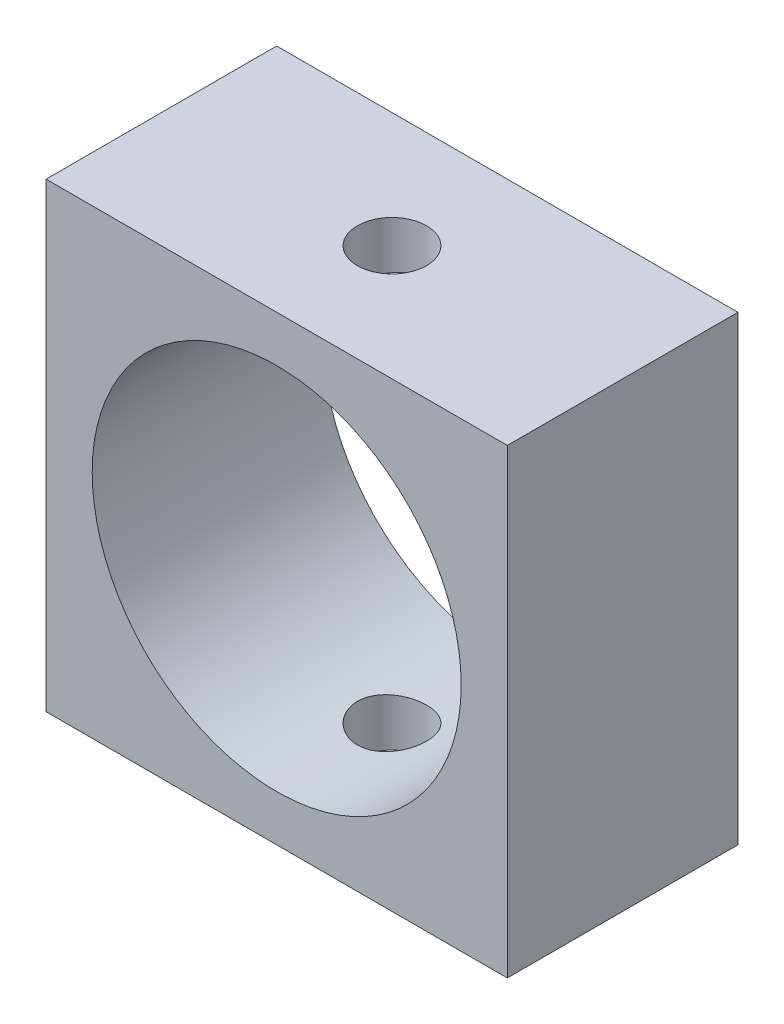
ISO-10303-21;
HEADER;
FILE_DESCRIPTION(('STEP AP214'),'2;1');
FILE_NAME('part.step','',(''),(''),'','','');
FILE_SCHEMA(('AUTOMOTIVE_DESIGN { 1 0 10303 214 1 1 1 1 }'));
ENDSEC;
DATA;
#1=APPLICATION_CONTEXT('core data for automotive mechanical design processes');
#2=APPLICATION_PROTOCOL_DEFINITION('international standard','automotive_design',2000,#1);
#3=PRODUCT_CONTEXT('',#1,'mechanical');
#4=PRODUCT('Part','Part','',(#3));
#5=PRODUCT_RELATED_PRODUCT_CATEGORY('part','',(#4));
#6=PRODUCT_DEFINITION_FORMATION('','',#4);
#7=PRODUCT_DEFINITION_CONTEXT('part definition',#1,'design');
#8=PRODUCT_DEFINITION('design','',#6,#7);
#9=PRODUCT_DEFINITION_SHAPE('','',#8);
#10=(LENGTH_UNIT() NAMED_UNIT(*) SI_UNIT(.MILLI.,.METRE.));
#11=(NAMED_UNIT(*) PLANE_ANGLE_UNIT() SI_UNIT($,.RADIAN.));
#12=(NAMED_UNIT(*) SI_UNIT($,.STERADIAN.) SOLID_ANGLE_UNIT());
#13=UNCERTAINTY_MEASURE_WITH_UNIT(LENGTH_MEASURE(1.E-05),#10,'distance_accuracy_value','');
#14=(GEOMETRIC_REPRESENTATION_CONTEXT(3) GLOBAL_UNCERTAINTY_ASSIGNED_CONTEXT((#13)) GLOBAL_UNIT_ASSIGNED_CONTEXT((#10,
#11,#12)) REPRESENTATION_CONTEXT('',''));
#15=CARTESIAN_POINT('',(0.,0.,0.));
#16=DIRECTION('',(0.,0.,1.));
#17=DIRECTION('',(1.,0.,0.));
#18=AXIS2_PLACEMENT_3D('',#15,#16,#17);
#19=CARTESIAN_POINT('',(0.,0.,10.));
#20=DIRECTION('',(0.,0.,-1.));
#21=DIRECTION('',(-1.,0.,0.));
#22=AXIS2_PLACEMENT_3D('',#19,#20,#21);
#23=PLANE('',#22);
#24=DIRECTION('',(0.,-1.,0.));
#25=VECTOR('',#24,1.);
#26=CARTESIAN_POINT('',(-10.,10.,10.));
#27=LINE('',#26,#25);
#28=CARTESIAN_POINT('',(-10.,10.,10.));
#29=VERTEX_POINT('',#28);
#30=CARTESIAN_POINT('',(-10.,-10.,10.));
#31=VERTEX_POINT('',#30);
#32=EDGE_CURVE('E106',#29,#31,#27,.T.);
#33=ORIENTED_EDGE('',*,*,#32,.T.);
#34=DIRECTION('',(1.,0.,0.));
#35=VECTOR('',#34,1.);
#36=CARTESIAN_POINT('',(10.,-10.,10.));
#37=LINE('',#36,#35);
#38=CARTESIAN_POINT('',(10.,-10.,10.));
#39=VERTEX_POINT('',#38);
#40=EDGE_CURVE('E101',#31,#39,#37,.T.);
#41=ORIENTED_EDGE('',*,*,#40,.T.);
#42=DIRECTION('',(0.,1.,0.));
#43=VECTOR('',#42,1.);
#44=CARTESIAN_POINT('',(10.,10.,10.));
#45=LINE('',#44,#43);
#46=CARTESIAN_POINT('',(10.,10.,10.));
#47=VERTEX_POINT('',#46);
#48=EDGE_CURVE('E104',#39,#47,#45,.T.);
#49=ORIENTED_EDGE('',*,*,#48,.T.);
#50=DIRECTION('',(-1.,0.,0.));
#51=VECTOR('',#50,1.);
#52=CARTESIAN_POINT('',(10.,10.,10.));
#53=LINE('',#52,#51);
#54=EDGE_CURVE('E71',#47,#29,#53,.T.);
#55=ORIENTED_EDGE('',*,*,#54,.T.);
#56=EDGE_LOOP('',(#33,#41,#49,#55));
#57=FACE_BOUND('',#56,.T.);
#58=CARTESIAN_POINT('',(0.,0.,10.));
#59=DIRECTION('',(0.,0.,1.));
#60=DIRECTION('',(1.,0.,0.));
#61=AXIS2_PLACEMENT_3D('',#58,#59,#60);
#62=CIRCLE('',#61,8.);
#63=CARTESIAN_POINT('',(8.,0.,10.));
#64=VERTEX_POINT('',#63);
#65=EDGE_CURVE('E122',#64,#64,#62,.T.);
#66=ORIENTED_EDGE('',*,*,#65,.F.);
#67=EDGE_LOOP('',(#66));
#68=FACE_BOUND('',#67,.T.);
#69=ADVANCED_FACE('F48',(#57,#68),#23,.F.);
#70=CARTESIAN_POINT('',(0.,0.,0.));
#71=DIRECTION('',(0.,0.,-1.));
#72=DIRECTION('',(-1.,0.,0.));
#73=AXIS2_PLACEMENT_3D('',#70,#71,#72);
#74=PLANE('',#73);
#75=DIRECTION('',(0.,-1.,0.));
#76=VECTOR('',#75,1.);
#77=CARTESIAN_POINT('',(-10.,10.,0.));
#78=LINE('',#77,#76);
#79=CARTESIAN_POINT('',(-10.,10.,0.));
#80=VERTEX_POINT('',#79);
#81=CARTESIAN_POINT('',(-10.,-10.,0.));
#82=VERTEX_POINT('',#81);
#83=EDGE_CURVE('E119',#80,#82,#78,.T.);
#84=ORIENTED_EDGE('',*,*,#83,.F.);
#85=DIRECTION('',(-1.,0.,0.));
#86=VECTOR('',#85,1.);
#87=CARTESIAN_POINT('',(10.,10.,0.));
#88=LINE('',#87,#86);
#89=CARTESIAN_POINT('',(10.,10.,0.));
#90=VERTEX_POINT('',#89);
#91=EDGE_CURVE('E94',#90,#80,#88,.T.);
#92=ORIENTED_EDGE('',*,*,#91,.F.);
#93=DIRECTION('',(0.,1.,0.));
#94=VECTOR('',#93,1.);
#95=CARTESIAN_POINT('',(10.,10.,0.));
#96=LINE('',#95,#94);
#97=CARTESIAN_POINT('',(10.,-10.,0.));
#98=VERTEX_POINT('',#97);
#99=EDGE_CURVE('E88',#98,#90,#96,.T.);
#100=ORIENTED_EDGE('',*,*,#99,.F.);
#101=DIRECTION('',(1.,0.,0.));
#102=VECTOR('',#101,1.);
#103=CARTESIAN_POINT('',(10.,-10.,0.));
#104=LINE('',#103,#102);
#105=EDGE_CURVE('E110',#82,#98,#104,.T.);
#106=ORIENTED_EDGE('',*,*,#105,.F.);
#107=EDGE_LOOP('',(#84,#92,#100,#106));
#108=FACE_BOUND('',#107,.T.);
#109=CARTESIAN_POINT('',(0.,0.,0.));
#110=DIRECTION('',(0.,0.,1.));
#111=DIRECTION('',(1.,0.,0.));
#112=AXIS2_PLACEMENT_3D('',#109,#110,#111);
#113=CIRCLE('',#112,8.);
#114=CARTESIAN_POINT('',(8.,0.,0.));
#115=VERTEX_POINT('',#114);
#116=EDGE_CURVE('E179',#115,#115,#113,.T.);
#117=ORIENTED_EDGE('',*,*,#116,.T.);
#118=EDGE_LOOP('',(#117));
#119=FACE_BOUND('',#118,.T.);
#120=ADVANCED_FACE('F151',(#108,#119),#74,.T.);
#121=CARTESIAN_POINT('',(-10.,10.,10.));
#122=DIRECTION('',(1.,0.,0.));
#123=DIRECTION('',(0.,0.,-1.));
#124=AXIS2_PLACEMENT_3D('',#121,#122,#123);
#125=PLANE('',#124);
#126=ORIENTED_EDGE('',*,*,#83,.T.);
#127=DIRECTION('',(0.,0.,-1.));
#128=VECTOR('',#127,1.);
#129=CARTESIAN_POINT('',(-10.,-10.,10.));
#130=LINE('',#129,#128);
#131=EDGE_CURVE('E13',#31,#82,#130,.T.);
#132=ORIENTED_EDGE('',*,*,#131,.F.);
#133=ORIENTED_EDGE('',*,*,#32,.F.);
#134=DIRECTION('',(0.,0.,-1.));
#135=VECTOR('',#134,1.);
#136=CARTESIAN_POINT('',(-10.,10.,10.));
#137=LINE('',#136,#135);
#138=EDGE_CURVE('E115',#29,#80,#137,.T.);
#139=ORIENTED_EDGE('',*,*,#138,.T.);
#140=EDGE_LOOP('',(#126,#132,#133,#139));
#141=FACE_BOUND('',#140,.T.);
#142=ADVANCED_FACE('F50',(#141),#125,.F.);
#143=CARTESIAN_POINT('',(10.,-10.,10.));
#144=DIRECTION('',(0.,1.,0.));
#145=DIRECTION('',(-1.,0.,0.));
#146=AXIS2_PLACEMENT_3D('',#143,#144,#145);
#147=PLANE('',#146);
#148=CARTESIAN_POINT('',(0.,-10.,5.));
#149=DIRECTION('',(0.,1.,0.));
#150=DIRECTION('',(0.,0.,1.));
#151=AXIS2_PLACEMENT_3D('',#148,#149,#150);
#152=CIRCLE('',#151,1.5);
#153=CARTESIAN_POINT('',(0.,-10.,6.5));
#154=VERTEX_POINT('',#153);
#155=EDGE_CURVE('E131',#154,#154,#152,.T.);
#156=ORIENTED_EDGE('',*,*,#155,.T.);
#157=EDGE_LOOP('',(#156));
#158=FACE_BOUND('',#157,.T.);
#159=ORIENTED_EDGE('',*,*,#105,.T.);
#160=DIRECTION('',(0.,0.,-1.));
#161=VECTOR('',#160,1.);
#162=CARTESIAN_POINT('',(10.,-10.,10.));
#163=LINE('',#162,#161);
#164=EDGE_CURVE('E62',#39,#98,#163,.T.);
#165=ORIENTED_EDGE('',*,*,#164,.F.);
#166=ORIENTED_EDGE('',*,*,#40,.F.);
#167=ORIENTED_EDGE('',*,*,#131,.T.);
#168=EDGE_LOOP('',(#159,#165,#166,#167));
#169=FACE_BOUND('',#168,.T.);
#170=ADVANCED_FACE('F109',(#158,#169),#147,.F.);
#171=CARTESIAN_POINT('',(10.,10.,10.));
#172=DIRECTION('',(-1.,0.,0.));
#173=DIRECTION('',(0.,-1.,0.));
#174=AXIS2_PLACEMENT_3D('',#171,#172,#173);
#175=PLANE('',#174);
#176=ORIENTED_EDGE('',*,*,#99,.T.);
#177=DIRECTION('',(0.,0.,-1.));
#178=VECTOR('',#177,1.);
#179=CARTESIAN_POINT('',(10.,10.,10.));
#180=LINE('',#179,#178);
#181=EDGE_CURVE('E111',#47,#90,#180,.T.);
#182=ORIENTED_EDGE('',*,*,#181,.F.);
#183=ORIENTED_EDGE('',*,*,#48,.F.);
#184=ORIENTED_EDGE('',*,*,#164,.T.);
#185=EDGE_LOOP('',(#176,#182,#183,#184));
#186=FACE_BOUND('',#185,.T.);
#187=ADVANCED_FACE('F113',(#186),#175,.F.);
#188=CARTESIAN_POINT('',(10.,10.,10.));
#189=DIRECTION('',(0.,-1.,0.));
#190=DIRECTION('',(1.,0.,0.));
#191=AXIS2_PLACEMENT_3D('',#188,#189,#190);
#192=PLANE('',#191);
#193=CARTESIAN_POINT('',(0.,10.,5.));
#194=DIRECTION('',(0.,1.,0.));
#195=DIRECTION('',(0.,0.,1.));
#196=AXIS2_PLACEMENT_3D('',#193,#194,#195);
#197=CIRCLE('',#196,1.5);
#198=CARTESIAN_POINT('',(0.,10.,6.5));
#199=VERTEX_POINT('',#198);
#200=EDGE_CURVE('E172',#199,#199,#197,.T.);
#201=ORIENTED_EDGE('',*,*,#200,.F.);
#202=EDGE_LOOP('',(#201));
#203=FACE_BOUND('',#202,.T.);
#204=ORIENTED_EDGE('',*,*,#91,.T.);
#205=ORIENTED_EDGE('',*,*,#138,.F.);
#206=ORIENTED_EDGE('',*,*,#54,.F.);
#207=ORIENTED_EDGE('',*,*,#181,.T.);
#208=EDGE_LOOP('',(#204,#205,#206,#207));
#209=FACE_BOUND('',#208,.T.);
#210=ADVANCED_FACE('F147',(#203,#209),#192,.F.);
#211=CARTESIAN_POINT('',(0.,0.,10.));
#212=DIRECTION('',(0.,0.,-1.));
#213=DIRECTION('',(-1.,0.,0.));
#214=AXIS2_PLACEMENT_3D('',#211,#212,#213);
#215=CYLINDRICAL_SURFACE('',#214,8.);
#216=CARTESIAN_POINT('',(0.,-8.,6.5));
#217=CARTESIAN_POINT('',(0.0834717464654725,-7.99999848833852,6.49999681041172));
#218=CARTESIAN_POINT('',(0.1669849927301,-7.99868009921714,6.49300892338062));
#219=CARTESIAN_POINT('',(0.331658129841799,-7.9935478589052,6.46526000488165));
#220=CARTESIAN_POINT('',(0.412815974152227,-7.98973190166897,6.44448734936027));
#221=CARTESIAN_POINT('',(0.570372961851803,-7.98003138765458,6.38982729874066));
#222=CARTESIAN_POINT('',(0.646776330685345,-7.97414869946483,6.35595174754746));
#223=CARTESIAN_POINT('',(0.792807973094008,-7.96095710599783,6.27608112307718));
#224=CARTESIAN_POINT('',(0.862436794477324,-7.9536483161829,6.23008703085518));
#225=CARTESIAN_POINT('',(0.993783715930504,-7.93831336430504,6.12670023199633));
#226=CARTESIAN_POINT('',(1.05540895503183,-7.93028034856351,6.06919055532986));
#227=CARTESIAN_POINT('',(1.16819606135369,-7.9144531845865,5.94465669091244));
#228=CARTESIAN_POINT('',(1.21935717689242,-7.90665905354527,5.87763182023072));
#229=CARTESIAN_POINT('',(1.31014998665793,-7.89212551245005,5.73531391163603));
#230=CARTESIAN_POINT('',(1.34968721969605,-7.88539493886182,5.65995962968276));
#231=CARTESIAN_POINT('',(1.41550524332283,-7.87384713211987,5.50353108482321));
#232=CARTESIAN_POINT('',(1.44178717713098,-7.86902973396962,5.42245731588878));
#233=CARTESIAN_POINT('',(1.480050535035,-7.8619226957455,5.25788476908559));
#234=CARTESIAN_POINT('',(1.49219390192039,-7.85960445366405,5.17442490279654));
#235=CARTESIAN_POINT('',(1.50233808095347,-7.85767197152761,5.00662261519175));
#236=CARTESIAN_POINT('',(1.50034016135374,-7.8580574889876,4.9222802736977));
#237=CARTESIAN_POINT('',(1.48238979602363,-7.86146292701753,4.75628047473395));
#238=CARTESIAN_POINT('',(1.46662149996045,-7.86444808147334,4.67460228569985));
#239=CARTESIAN_POINT('',(1.42186799396207,-7.87266183284666,4.51507158021739));
#240=CARTESIAN_POINT('',(1.392882222395,-7.87789052509516,4.4372192264907));
#241=CARTESIAN_POINT('',(1.322336471793,-7.89003855292588,4.28701132099974));
#242=CARTESIAN_POINT('',(1.28070213532456,-7.89696783823366,4.21469152941919));
#243=CARTESIAN_POINT('',(1.18609368930416,-7.91172971602918,4.07799527145977));
#244=CARTESIAN_POINT('',(1.13311842889266,-7.91956240015522,4.0136196122852));
#245=CARTESIAN_POINT('',(1.01633905685298,-7.93540001272164,3.89357504432754));
#246=CARTESIAN_POINT('',(0.952377436860684,-7.94340571024031,3.83805934754826));
#247=CARTESIAN_POINT('',(0.815968037098828,-7.95857386108318,3.7385227593246));
#248=CARTESIAN_POINT('',(0.743520172255771,-7.96573630595245,3.69450198312958));
#249=CARTESIAN_POINT('',(0.59203498887467,-7.97842539677509,3.61918224612998));
#250=CARTESIAN_POINT('',(0.512989564446495,-7.98394999136289,3.5878992208821));
#251=CARTESIAN_POINT('',(0.350639115398698,-7.99272505402719,3.53909790690784));
#252=CARTESIAN_POINT('',(0.267334544277789,-7.99597576367994,3.52157815595464));
#253=CARTESIAN_POINT('',(0.100148652903387,-7.99980360641981,3.50101396898173));
#254=CARTESIAN_POINT('',(0.0162940126341372,-8.00041950912279,3.49775960847027));
#255=CARTESIAN_POINT('',(-0.150761248092182,-7.99901543598228,3.50525547954765));
#256=CARTESIAN_POINT('',(-0.233961900480383,-7.99699558964431,3.51600502306526));
#257=CARTESIAN_POINT('',(-0.396681573218215,-7.99057111500406,3.55102903518337));
#258=CARTESIAN_POINT('',(-0.476224261046061,-7.98618522374031,3.57519728253781));
#259=CARTESIAN_POINT('',(-0.630128631824631,-7.97551842212498,3.63625770677879));
#260=CARTESIAN_POINT('',(-0.704489962595101,-7.96923738311334,3.67315074756579));
#261=CARTESIAN_POINT('',(-0.846816671513212,-7.95538030357666,3.75907812815951));
#262=CARTESIAN_POINT('',(-0.914703277015119,-7.94779086174563,3.80824073853684));
#263=CARTESIAN_POINT('',(-1.04133832326454,-7.93219343489712,3.91713813736236));
#264=CARTESIAN_POINT('',(-1.10008590976086,-7.92418541084687,3.97687391300133));
#265=CARTESIAN_POINT('',(-1.20757295872048,-7.9085247569745,4.10617231891143));
#266=CARTESIAN_POINT('',(-1.25616916218576,-7.90087825860257,4.17585490812539));
#267=CARTESIAN_POINT('',(-1.34096675057787,-7.88692985578532,4.32251762452375));
#268=CARTESIAN_POINT('',(-1.37716859613924,-7.8806279013735,4.39949748037047));
#269=CARTESIAN_POINT('',(-1.43594673512823,-7.87013024209574,4.55820586724254));
#270=CARTESIAN_POINT('',(-1.45858868794786,-7.86592440436878,4.63990937955933));
#271=CARTESIAN_POINT('',(-1.48980679326235,-7.86007203802415,4.8060472225214));
#272=CARTESIAN_POINT('',(-1.49838453270708,-7.8584252206579,4.8904812439704));
#273=CARTESIAN_POINT('',(-1.50117762148355,-7.85789199803857,5.05824833144151));
#274=CARTESIAN_POINT('',(-1.49561895003499,-7.85896215974293,5.14157758095699));
#275=CARTESIAN_POINT('',(-1.47079175378803,-7.86364600659998,5.30609142204529));
#276=CARTESIAN_POINT('',(-1.45152331089332,-7.86725967655747,5.38727602642744));
#277=CARTESIAN_POINT('',(-1.39991887583263,-7.8766050802318,5.54507448479548));
#278=CARTESIAN_POINT('',(-1.36760735397252,-7.88233284594965,5.62169659134577));
#279=CARTESIAN_POINT('',(-1.29085868912204,-7.8952638755184,5.76846825424084));
#280=CARTESIAN_POINT('',(-1.24642068948186,-7.90246724360119,5.83861735284478));
#281=CARTESIAN_POINT('',(-1.14589487339535,-7.91767266107745,5.97158368004229));
#282=CARTESIAN_POINT('',(-1.08964259864303,-7.92568505353043,6.0342754125671));
#283=CARTESIAN_POINT('',(-0.967427926742289,-7.94152833918735,6.14940516246452));
#284=CARTESIAN_POINT('',(-0.901463301891614,-7.94935919027328,6.20184082098014));
#285=CARTESIAN_POINT('',(-0.760984945071871,-7.96403975968049,6.29541095262706));
#286=CARTESIAN_POINT('',(-0.686399590640515,-7.97088000990561,6.33643942849064));
#287=CARTESIAN_POINT('',(-0.531290113653832,-7.98271619380687,6.40531763660513));
#288=CARTESIAN_POINT('',(-0.450771651705247,-7.98771385879037,6.43317974704691));
#289=CARTESIAN_POINT('',(-0.308347202825152,-7.99428290707632,6.46927731441868));
#290=CARTESIAN_POINT('',(-0.247273810251869,-7.99641470878206,6.4807786303128));
#291=CARTESIAN_POINT('',(-0.124141247115156,-7.9992737995401,6.49614106211645));
#292=CARTESIAN_POINT('',(-0.0620821016527076,-8.00000112429805,6.50000237225591));
#293=CARTESIAN_POINT('',(0.,-8.,6.5));
#294=B_SPLINE_CURVE_WITH_KNOTS('',3,(#216,#217,#218,#219,#220,#221,#222,#223,#224,#225,#226,
#227,#228,#229,#230,#231,#232,#233,#234,#235,#236,#237,#238,#239,#240,#241,#242,#243,#244,#245,
#246,#247,#248,#249,#250,#251,#252,#253,#254,#255,#256,#257,#258,#259,#260,#261,#262,#263,#264,
#265,#266,#267,#268,#269,#270,#271,#272,#273,#274,#275,#276,#277,#278,#279,#280,#281,#282,#283,
#284,#285,#286,#287,#288,#289,#290,#291,#292,#293),.UNSPECIFIED.,.T.,.F.,(4,2,2,2,2,2,2,2,2,2,2,
2,2,2,2,2,2,2,2,2,2,2,2,2,2,2,2,2,2,2,2,2,2,2,2,2,2,2,4),(0.,0.250188200964924,
0.500587642535452,0.750761271230907,1.00091465336891,1.2537511801363,1.50660586283617,
1.76146190504357,2.01629596311948,2.26818151445336,2.52004447587256,2.76859000612765,
3.01714609846786,3.26719262629531,3.51726454049859,3.77127768464077,4.02529337544948,
4.27962588321699,4.53393136673745,4.78448174076097,5.03501980464583,5.28360233907828,
5.53220175338032,5.78351778017708,6.03485728413098,6.28953436987299,6.54420198954945,
6.79762627818559,7.05102196946513,7.30039252231748,7.54976158541507,7.79866496207693,
8.04758592655423,8.3002336996638,8.55293951262255,8.80792048916314,9.06266126931173,
9.24874344524409,9.43482089039541),.UNSPECIFIED.);
#295=CARTESIAN_POINT('',(0.,-8.,6.5));
#296=VERTEX_POINT('',#295);
#297=EDGE_CURVE('E52',#296,#296,#294,.T.);
#298=ORIENTED_EDGE('',*,*,#297,.F.);
#299=EDGE_LOOP('',(#298));
#300=FACE_BOUND('',#299,.T.);
#301=CARTESIAN_POINT('',(0.,8.,6.5));
#302=CARTESIAN_POINT('',(-0.0834717464654692,7.99999848833852,6.49999681041172));
#303=CARTESIAN_POINT('',(-0.166984992730097,7.99868009921714,6.49300892338062));
#304=CARTESIAN_POINT('',(-0.331658129841796,7.9935478589052,6.46526000488165));
#305=CARTESIAN_POINT('',(-0.412815974152224,7.98973190166897,6.44448734936027));
#306=CARTESIAN_POINT('',(-0.5703729618518,7.98003138765458,6.38982729874066));
#307=CARTESIAN_POINT('',(-0.646776330685343,7.97414869946483,6.35595174754746));
#308=CARTESIAN_POINT('',(-0.792807973094005,7.96095710599783,6.27608112307718));
#309=CARTESIAN_POINT('',(-0.862436794477322,7.9536483161829,6.23008703085518));
#310=CARTESIAN_POINT('',(-0.993783715930501,7.93831336430504,6.12670023199632));
#311=CARTESIAN_POINT('',(-1.05540895503183,7.93028034856351,6.06919055532986));
#312=CARTESIAN_POINT('',(-1.16819606135369,7.9144531845865,5.94465669091244));
#313=CARTESIAN_POINT('',(-1.21935717689241,7.90665905354528,5.87763182023071));
#314=CARTESIAN_POINT('',(-1.31014998665793,7.89212551245006,5.73531391163603));
#315=CARTESIAN_POINT('',(-1.34968721969605,7.88539493886182,5.65995962968276));
#316=CARTESIAN_POINT('',(-1.41550524332283,7.87384713211987,5.50353108482321));
#317=CARTESIAN_POINT('',(-1.44178717713098,7.86902973396962,5.42245731588878));
#318=CARTESIAN_POINT('',(-1.480050535035,7.8619226957455,5.25788476908559));
#319=CARTESIAN_POINT('',(-1.49219390192039,7.85960445366405,5.17442490279653));
#320=CARTESIAN_POINT('',(-1.50233808095346,7.85767197152761,5.00662261519175));
#321=CARTESIAN_POINT('',(-1.50034016135374,7.8580574889876,4.9222802736977));
#322=CARTESIAN_POINT('',(-1.48238979602362,7.86146292701753,4.75628047473395));
#323=CARTESIAN_POINT('',(-1.46662149996045,7.86444808147334,4.67460228569985));
#324=CARTESIAN_POINT('',(-1.42186799396207,7.87266183284666,4.51507158021739));
#325=CARTESIAN_POINT('',(-1.39288222239499,7.87789052509516,4.4372192264907));
#326=CARTESIAN_POINT('',(-1.322336471793,7.89003855292589,4.28701132099974));
#327=CARTESIAN_POINT('',(-1.28070213532456,7.89696783823366,4.21469152941919));
#328=CARTESIAN_POINT('',(-1.18609368930416,7.91172971602918,4.07799527145977));
#329=CARTESIAN_POINT('',(-1.13311842889266,7.91956240015522,4.0136196122852));
#330=CARTESIAN_POINT('',(-1.01633905685297,7.93540001272164,3.89357504432754));
#331=CARTESIAN_POINT('',(-0.95237743686068,7.94340571024031,3.83805934754826));
#332=CARTESIAN_POINT('',(-0.815968037098824,7.95857386108318,3.73852275932459));
#333=CARTESIAN_POINT('',(-0.743520172255767,7.96573630595245,3.69450198312958));
#334=CARTESIAN_POINT('',(-0.592034988874666,7.97842539677509,3.61918224612998));
#335=CARTESIAN_POINT('',(-0.512989564446492,7.98394999136289,3.58789922088211));
#336=CARTESIAN_POINT('',(-0.350639115398695,7.99272505402719,3.53909790690784));
#337=CARTESIAN_POINT('',(-0.267334544277786,7.99597576367994,3.52157815595464));
#338=CARTESIAN_POINT('',(-0.100148652903384,7.99980360641981,3.50101396898173));
#339=CARTESIAN_POINT('',(-0.0162940126341337,8.00041950912279,3.49775960847027));
#340=CARTESIAN_POINT('',(0.150761248092186,7.99901543598228,3.50525547954765));
#341=CARTESIAN_POINT('',(0.233961900480387,7.99699558964431,3.51600502306526));
#342=CARTESIAN_POINT('',(0.396681573218219,7.99057111500406,3.55102903518337));
#343=CARTESIAN_POINT('',(0.476224261046065,7.98618522374031,3.57519728253781));
#344=CARTESIAN_POINT('',(0.630128631824635,7.97551842212498,3.63625770677879));
#345=CARTESIAN_POINT('',(0.704489962595105,7.96923738311334,3.67315074756579));
#346=CARTESIAN_POINT('',(0.846816671513216,7.95538030357666,3.75907812815951));
#347=CARTESIAN_POINT('',(0.914703277015123,7.94779086174563,3.80824073853684));
#348=CARTESIAN_POINT('',(1.04133832326455,7.93219343489711,3.91713813736236));
#349=CARTESIAN_POINT('',(1.10008590976087,7.92418541084687,3.97687391300133));
#350=CARTESIAN_POINT('',(1.20757295872048,7.9085247569745,4.10617231891143));
#351=CARTESIAN_POINT('',(1.25616916218577,7.90087825860257,4.17585490812539));
#352=CARTESIAN_POINT('',(1.34096675057787,7.88692985578532,4.32251762452375));
#353=CARTESIAN_POINT('',(1.37716859613924,7.8806279013735,4.39949748037047));
#354=CARTESIAN_POINT('',(1.43594673512823,7.87013024209574,4.55820586724254));
#355=CARTESIAN_POINT('',(1.45858868794786,7.86592440436878,4.63990937955933));
#356=CARTESIAN_POINT('',(1.48980679326236,7.86007203802415,4.8060472225214));
#357=CARTESIAN_POINT('',(1.49838453270708,7.8584252206579,4.8904812439704));
#358=CARTESIAN_POINT('',(1.50117762148355,7.85789199803857,5.05824833144151));
#359=CARTESIAN_POINT('',(1.49561895003499,7.85896215974293,5.141577580957));
#360=CARTESIAN_POINT('',(1.47079175378803,7.86364600659998,5.30609142204529));
#361=CARTESIAN_POINT('',(1.45152331089332,7.86725967655747,5.38727602642744));
#362=CARTESIAN_POINT('',(1.39991887583263,7.8766050802318,5.54507448479548));
#363=CARTESIAN_POINT('',(1.36760735397253,7.88233284594965,5.62169659134577));
#364=CARTESIAN_POINT('',(1.29085868912204,7.8952638755184,5.76846825424084));
#365=CARTESIAN_POINT('',(1.24642068948186,7.90246724360119,5.83861735284478));
#366=CARTESIAN_POINT('',(1.14589487339535,7.91767266107745,5.9715836800423));
#367=CARTESIAN_POINT('',(1.08964259864304,7.92568505353043,6.0342754125671));
#368=CARTESIAN_POINT('',(0.967427926742293,7.94152833918735,6.14940516246452));
#369=CARTESIAN_POINT('',(0.901463301891617,7.94935919027328,6.20184082098014));
#370=CARTESIAN_POINT('',(0.760984945071874,7.96403975968049,6.29541095262706));
#371=CARTESIAN_POINT('',(0.686399590640518,7.97088000990561,6.33643942849064));
#372=CARTESIAN_POINT('',(0.531290113653835,7.98271619380687,6.40531763660514));
#373=CARTESIAN_POINT('',(0.45077165170525,7.98771385879037,6.43317974704691));
#374=CARTESIAN_POINT('',(0.308347202825156,7.99428290707632,6.46927731441868));
#375=CARTESIAN_POINT('',(0.247273810251872,7.99641470878206,6.4807786303128));
#376=CARTESIAN_POINT('',(0.124141247115159,7.9992737995401,6.49614106211645));
#377=CARTESIAN_POINT('',(0.0620821016527111,8.00000112429805,6.50000237225591));
#378=CARTESIAN_POINT('',(0.,8.,6.5));
#379=B_SPLINE_CURVE_WITH_KNOTS('',3,(#301,#302,#303,#304,#305,#306,#307,#308,#309,#310,#311,
#312,#313,#314,#315,#316,#317,#318,#319,#320,#321,#322,#323,#324,#325,#326,#327,#328,#329,#330,
#331,#332,#333,#334,#335,#336,#337,#338,#339,#340,#341,#342,#343,#344,#345,#346,#347,#348,#349,
#350,#351,#352,#353,#354,#355,#356,#357,#358,#359,#360,#361,#362,#363,#364,#365,#366,#367,#368,
#369,#370,#371,#372,#373,#374,#375,#376,#377,#378),.UNSPECIFIED.,.T.,.F.,(4,2,2,2,2,2,2,2,2,2,2,
2,2,2,2,2,2,2,2,2,2,2,2,2,2,2,2,2,2,2,2,2,2,2,2,2,2,2,4),(0.,0.250188200964924,
0.500587642535452,0.750761271230908,1.00091465336891,1.25375118013631,1.50660586283617,
1.76146190504357,2.01629596311949,2.26818151445336,2.52004447587256,2.76859000612766,
3.01714609846787,3.26719262629531,3.5172645404986,3.77127768464077,4.02529337544948,
4.27962588321699,4.53393136673745,4.78448174076097,5.03501980464583,5.28360233907828,
5.53220175338032,5.78351778017708,6.03485728413098,6.28953436987299,6.54420198954945,
6.79762627818559,7.05102196946513,7.30039252231749,7.54976158541507,7.79866496207693,
8.04758592655423,8.3002336996638,8.55293951262255,8.80792048916315,9.06266126931173,
9.24874344524409,9.43482089039541),.UNSPECIFIED.);
#380=CARTESIAN_POINT('',(0.,8.,6.5));
#381=VERTEX_POINT('',#380);
#382=EDGE_CURVE('E127',#381,#381,#379,.T.);
#383=ORIENTED_EDGE('',*,*,#382,.F.);
#384=EDGE_LOOP('',(#383));
#385=FACE_BOUND('',#384,.T.);
#386=ORIENTED_EDGE('',*,*,#65,.T.);
#387=EDGE_LOOP('',(#386));
#388=FACE_BOUND('',#387,.T.);
#389=ORIENTED_EDGE('',*,*,#116,.F.);
#390=EDGE_LOOP('',(#389));
#391=FACE_BOUND('',#390,.T.);
#392=ADVANCED_FACE('F132',(#300,#385,#388,#391),#215,.F.);
#393=CARTESIAN_POINT('',(0.,-10.,5.));
#394=DIRECTION('',(0.,1.,0.));
#395=DIRECTION('',(0.,0.,1.));
#396=AXIS2_PLACEMENT_3D('',#393,#394,#395);
#397=CYLINDRICAL_SURFACE('',#396,1.5);
#398=ORIENTED_EDGE('',*,*,#382,.T.);
#399=EDGE_LOOP('',(#398));
#400=FACE_BOUND('',#399,.T.);
#401=ORIENTED_EDGE('',*,*,#200,.T.);
#402=EDGE_LOOP('',(#401));
#403=FACE_BOUND('',#402,.T.);
#404=ADVANCED_FACE('F135',(#400,#403),#397,.F.);
#405=ORIENTED_EDGE('',*,*,#297,.T.);
#406=EDGE_LOOP('',(#405));
#407=FACE_BOUND('',#406,.T.);
#408=ORIENTED_EDGE('',*,*,#155,.F.);
#409=EDGE_LOOP('',(#408));
#410=FACE_BOUND('',#409,.T.);
#411=ADVANCED_FACE('F138',(#407,#410),#397,.F.);
#412=CLOSED_SHELL('',(#69,#120,#142,#170,#187,#210,#392,#404,#411));
#413=MANIFOLD_SOLID_BREP('B2',#412);
#414=ADVANCED_BREP_SHAPE_REPRESENTATION('',(#18,#413),#14);
#415=SHAPE_DEFINITION_REPRESENTATION(#9,#414);
ENDSEC;
END-ISO-10303-21;
